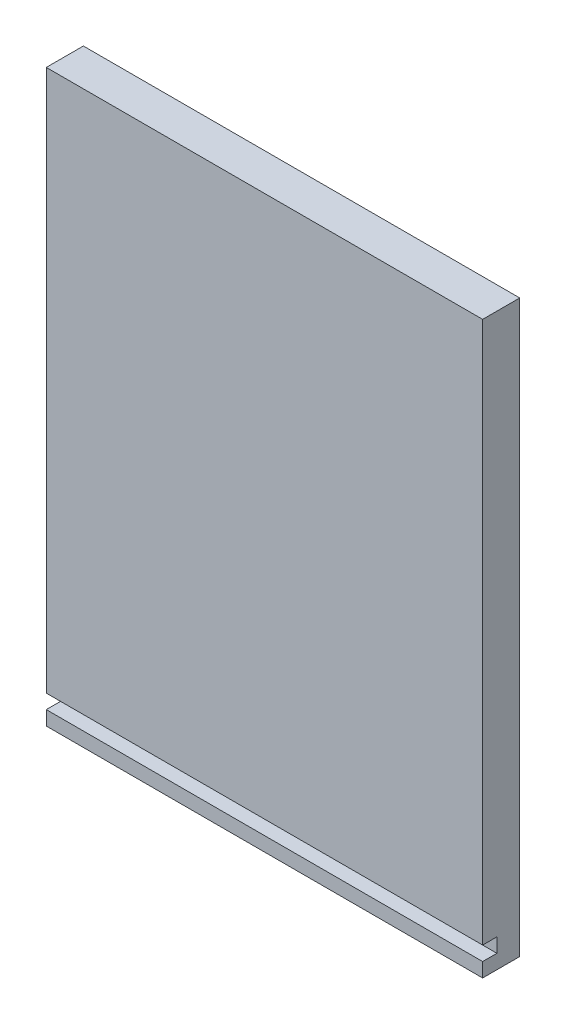
ISO-10303-21;
HEADER;
FILE_DESCRIPTION(('STEP AP214'),'2;1');
FILE_NAME('part.step','',(''),(''),'','','');
FILE_SCHEMA(('AUTOMOTIVE_DESIGN { 1 0 10303 214 1 1 1 1 }'));
ENDSEC;
DATA;
#1=APPLICATION_CONTEXT('core data for automotive mechanical design processes');
#2=APPLICATION_PROTOCOL_DEFINITION('international standard','automotive_design',2000,#1);
#3=PRODUCT_CONTEXT('',#1,'mechanical');
#4=PRODUCT('Part','Part','',(#3));
#5=PRODUCT_RELATED_PRODUCT_CATEGORY('part','',(#4));
#6=PRODUCT_DEFINITION_FORMATION('','',#4);
#7=PRODUCT_DEFINITION_CONTEXT('part definition',#1,'design');
#8=PRODUCT_DEFINITION('design','',#6,#7);
#9=PRODUCT_DEFINITION_SHAPE('','',#8);
#10=(LENGTH_UNIT() NAMED_UNIT(*) SI_UNIT(.MILLI.,.METRE.));
#11=(NAMED_UNIT(*) PLANE_ANGLE_UNIT() SI_UNIT($,.RADIAN.));
#12=(NAMED_UNIT(*) SI_UNIT($,.STERADIAN.) SOLID_ANGLE_UNIT());
#13=UNCERTAINTY_MEASURE_WITH_UNIT(LENGTH_MEASURE(1.E-05),#10,'distance_accuracy_value','');
#14=(GEOMETRIC_REPRESENTATION_CONTEXT(3) GLOBAL_UNCERTAINTY_ASSIGNED_CONTEXT((#13)) GLOBAL_UNIT_ASSIGNED_CONTEXT((#10,
#11,#12)) REPRESENTATION_CONTEXT('',''));
#15=CARTESIAN_POINT('',(0.,0.,0.));
#16=DIRECTION('',(0.,0.,1.));
#17=DIRECTION('',(1.,0.,0.));
#18=AXIS2_PLACEMENT_3D('',#15,#16,#17);
#19=CARTESIAN_POINT('',(0.,0.,13.));
#20=DIRECTION('',(0.,0.,1.));
#21=DIRECTION('',(1.,0.,0.));
#22=AXIS2_PLACEMENT_3D('',#19,#20,#21);
#23=PLANE('',#22);
#24=DIRECTION('',(-1.,0.,0.));
#25=VECTOR('',#24,1.);
#26=CARTESIAN_POINT('',(-53.9801317233809,-56.6642857142857,13.));
#27=LINE('',#26,#25);
#28=CARTESIAN_POINT('',(99.0198682766191,-56.6642857142857,13.));
#29=VERTEX_POINT('',#28);
#30=CARTESIAN_POINT('',(-53.9801317233809,-56.6642857142857,13.));
#31=VERTEX_POINT('',#30);
#32=EDGE_CURVE('E123',#29,#31,#27,.T.);
#33=ORIENTED_EDGE('',*,*,#32,.F.);
#34=DIRECTION('',(0.,1.,0.));
#35=VECTOR('',#34,1.);
#36=CARTESIAN_POINT('',(99.0198682766191,133.335714285714,13.));
#37=LINE('',#36,#35);
#38=CARTESIAN_POINT('',(99.0198682766191,133.335714285714,13.));
#39=VERTEX_POINT('',#38);
#40=EDGE_CURVE('E136',#29,#39,#37,.T.);
#41=ORIENTED_EDGE('',*,*,#40,.T.);
#42=DIRECTION('',(-1.,0.,0.));
#43=VECTOR('',#42,1.);
#44=CARTESIAN_POINT('',(-53.9801317233809,133.335714285714,13.));
#45=LINE('',#44,#43);
#46=CARTESIAN_POINT('',(-53.9801317233809,133.335714285714,13.));
#47=VERTEX_POINT('',#46);
#48=EDGE_CURVE('E57',#39,#47,#45,.T.);
#49=ORIENTED_EDGE('',*,*,#48,.T.);
#50=DIRECTION('',(0.,-1.,0.));
#51=VECTOR('',#50,1.);
#52=CARTESIAN_POINT('',(-53.9801317233809,133.335714285714,13.));
#53=LINE('',#52,#51);
#54=EDGE_CURVE('E132',#47,#31,#53,.T.);
#55=ORIENTED_EDGE('',*,*,#54,.T.);
#56=EDGE_LOOP('',(#33,#41,#49,#55));
#57=FACE_BOUND('',#56,.T.);
#58=ADVANCED_FACE('F33',(#57),#23,.T.);
#59=CARTESIAN_POINT('',(-53.9801317233809,133.335714285714,13.));
#60=DIRECTION('',(1.,0.,0.));
#61=DIRECTION('',(0.,1.,0.));
#62=AXIS2_PLACEMENT_3D('',#59,#60,#61);
#63=PLANE('',#62);
#64=DIRECTION('',(0.,-1.,0.));
#65=VECTOR('',#64,1.);
#66=CARTESIAN_POINT('',(-53.9801317233809,-56.6642857142857,8.));
#67=LINE('',#66,#65);
#68=CARTESIAN_POINT('',(-53.9801317233809,-56.6642857142857,8.));
#69=VERTEX_POINT('',#68);
#70=CARTESIAN_POINT('',(-53.9801317233809,-61.6642857142857,8.));
#71=VERTEX_POINT('',#70);
#72=EDGE_CURVE('E114',#69,#71,#67,.T.);
#73=ORIENTED_EDGE('',*,*,#72,.F.);
#74=DIRECTION('',(0.,0.,1.));
#75=VECTOR('',#74,1.);
#76=CARTESIAN_POINT('',(-53.9801317233809,-56.6642857142857,8.));
#77=LINE('',#76,#75);
#78=EDGE_CURVE('E146',#69,#31,#77,.T.);
#79=ORIENTED_EDGE('',*,*,#78,.T.);
#80=ORIENTED_EDGE('',*,*,#54,.F.);
#81=DIRECTION('',(0.,0.,-1.));
#82=VECTOR('',#81,1.);
#83=CARTESIAN_POINT('',(-53.9801317233809,133.335714285714,13.));
#84=LINE('',#83,#82);
#85=CARTESIAN_POINT('',(-53.9801317233809,133.335714285714,0.));
#86=VERTEX_POINT('',#85);
#87=EDGE_CURVE('E141',#47,#86,#84,.T.);
#88=ORIENTED_EDGE('',*,*,#87,.T.);
#89=DIRECTION('',(0.,-1.,0.));
#90=VECTOR('',#89,1.);
#91=CARTESIAN_POINT('',(-53.9801317233809,133.335714285714,0.));
#92=LINE('',#91,#90);
#93=CARTESIAN_POINT('',(-53.9801317233809,-66.6642857142857,0.));
#94=VERTEX_POINT('',#93);
#95=EDGE_CURVE('E142',#86,#94,#92,.T.);
#96=ORIENTED_EDGE('',*,*,#95,.T.);
#97=DIRECTION('',(0.,0.,-1.));
#98=VECTOR('',#97,1.);
#99=CARTESIAN_POINT('',(-53.9801317233809,-66.6642857142857,13.));
#100=LINE('',#99,#98);
#101=CARTESIAN_POINT('',(-53.9801317233809,-66.6642857142857,13.));
#102=VERTEX_POINT('',#101);
#103=EDGE_CURVE('E11',#102,#94,#100,.T.);
#104=ORIENTED_EDGE('',*,*,#103,.F.);
#105=CARTESIAN_POINT('',(-53.9801317233809,-61.6642857142857,13.));
#106=VERTEX_POINT('',#105);
#107=EDGE_CURVE('E85',#106,#102,#53,.T.);
#108=ORIENTED_EDGE('',*,*,#107,.F.);
#109=DIRECTION('',(0.,0.,1.));
#110=VECTOR('',#109,1.);
#111=CARTESIAN_POINT('',(-53.9801317233809,-61.6642857142857,8.));
#112=LINE('',#111,#110);
#113=EDGE_CURVE('E48',#71,#106,#112,.T.);
#114=ORIENTED_EDGE('',*,*,#113,.F.);
#115=EDGE_LOOP('',(#73,#79,#80,#88,#96,#104,#108,#114));
#116=FACE_BOUND('',#115,.T.);
#117=ADVANCED_FACE('F35',(#116),#63,.F.);
#118=CARTESIAN_POINT('',(-53.9801317233809,-66.6642857142857,13.));
#119=DIRECTION('',(0.,1.,0.));
#120=DIRECTION('',(0.,0.,1.));
#121=AXIS2_PLACEMENT_3D('',#118,#119,#120);
#122=PLANE('',#121);
#123=DIRECTION('',(1.,0.,0.));
#124=VECTOR('',#123,1.);
#125=CARTESIAN_POINT('',(-53.9801317233809,-66.6642857142857,0.));
#126=LINE('',#125,#124);
#127=CARTESIAN_POINT('',(99.0198682766191,-66.6642857142857,0.));
#128=VERTEX_POINT('',#127);
#129=EDGE_CURVE('E145',#94,#128,#126,.T.);
#130=ORIENTED_EDGE('',*,*,#129,.T.);
#131=DIRECTION('',(0.,0.,-1.));
#132=VECTOR('',#131,1.);
#133=CARTESIAN_POINT('',(99.0198682766191,-66.6642857142857,13.));
#134=LINE('',#133,#132);
#135=CARTESIAN_POINT('',(99.0198682766191,-66.6642857142857,13.));
#136=VERTEX_POINT('',#135);
#137=EDGE_CURVE('E41',#136,#128,#134,.T.);
#138=ORIENTED_EDGE('',*,*,#137,.F.);
#139=DIRECTION('',(1.,0.,0.));
#140=VECTOR('',#139,1.);
#141=CARTESIAN_POINT('',(-53.9801317233809,-66.6642857142857,13.));
#142=LINE('',#141,#140);
#143=EDGE_CURVE('E134',#102,#136,#142,.T.);
#144=ORIENTED_EDGE('',*,*,#143,.F.);
#145=ORIENTED_EDGE('',*,*,#103,.T.);
#146=EDGE_LOOP('',(#130,#138,#144,#145));
#147=FACE_BOUND('',#146,.T.);
#148=ADVANCED_FACE('F190',(#147),#122,.F.);
#149=CARTESIAN_POINT('',(99.0198682766191,133.335714285714,13.));
#150=DIRECTION('',(-1.,0.,0.));
#151=DIRECTION('',(0.,-1.,0.));
#152=AXIS2_PLACEMENT_3D('',#149,#150,#151);
#153=PLANE('',#152);
#154=ORIENTED_EDGE('',*,*,#40,.F.);
#155=DIRECTION('',(0.,0.,1.));
#156=VECTOR('',#155,1.);
#157=CARTESIAN_POINT('',(99.0198682766191,-56.6642857142857,8.));
#158=LINE('',#157,#156);
#159=CARTESIAN_POINT('',(99.0198682766191,-56.6642857142857,8.));
#160=VERTEX_POINT('',#159);
#161=EDGE_CURVE('E127',#160,#29,#158,.T.);
#162=ORIENTED_EDGE('',*,*,#161,.F.);
#163=DIRECTION('',(0.,1.,0.));
#164=VECTOR('',#163,1.);
#165=CARTESIAN_POINT('',(99.0198682766191,-56.6642857142857,8.));
#166=LINE('',#165,#164);
#167=CARTESIAN_POINT('',(99.0198682766191,-61.6642857142857,8.));
#168=VERTEX_POINT('',#167);
#169=EDGE_CURVE('E113',#168,#160,#166,.T.);
#170=ORIENTED_EDGE('',*,*,#169,.F.);
#171=DIRECTION('',(0.,0.,1.));
#172=VECTOR('',#171,1.);
#173=CARTESIAN_POINT('',(99.0198682766191,-61.6642857142857,8.));
#174=LINE('',#173,#172);
#175=CARTESIAN_POINT('',(99.0198682766191,-61.6642857142857,13.));
#176=VERTEX_POINT('',#175);
#177=EDGE_CURVE('E110',#168,#176,#174,.T.);
#178=ORIENTED_EDGE('',*,*,#177,.T.);
#179=EDGE_CURVE('E137',#136,#176,#37,.T.);
#180=ORIENTED_EDGE('',*,*,#179,.F.);
#181=ORIENTED_EDGE('',*,*,#137,.T.);
#182=DIRECTION('',(0.,1.,0.));
#183=VECTOR('',#182,1.);
#184=CARTESIAN_POINT('',(99.0198682766191,133.335714285714,0.));
#185=LINE('',#184,#183);
#186=CARTESIAN_POINT('',(99.0198682766191,133.335714285714,0.));
#187=VERTEX_POINT('',#186);
#188=EDGE_CURVE('E148',#128,#187,#185,.T.);
#189=ORIENTED_EDGE('',*,*,#188,.T.);
#190=DIRECTION('',(0.,0.,-1.));
#191=VECTOR('',#190,1.);
#192=CARTESIAN_POINT('',(99.0198682766191,133.335714285714,13.));
#193=LINE('',#192,#191);
#194=EDGE_CURVE('E152',#39,#187,#193,.T.);
#195=ORIENTED_EDGE('',*,*,#194,.F.);
#196=EDGE_LOOP('',(#154,#162,#170,#178,#180,#181,#189,#195));
#197=FACE_BOUND('',#196,.T.);
#198=ADVANCED_FACE('F159',(#197),#153,.F.);
#199=CARTESIAN_POINT('',(-53.9801317233809,133.335714285714,13.));
#200=DIRECTION('',(0.,-1.,0.));
#201=DIRECTION('',(0.,0.,-1.));
#202=AXIS2_PLACEMENT_3D('',#199,#200,#201);
#203=PLANE('',#202);
#204=DIRECTION('',(-1.,0.,0.));
#205=VECTOR('',#204,1.);
#206=CARTESIAN_POINT('',(-53.9801317233809,133.335714285714,0.));
#207=LINE('',#206,#205);
#208=EDGE_CURVE('E78',#187,#86,#207,.T.);
#209=ORIENTED_EDGE('',*,*,#208,.T.);
#210=ORIENTED_EDGE('',*,*,#87,.F.);
#211=ORIENTED_EDGE('',*,*,#48,.F.);
#212=ORIENTED_EDGE('',*,*,#194,.T.);
#213=EDGE_LOOP('',(#209,#210,#211,#212));
#214=FACE_BOUND('',#213,.T.);
#215=ADVANCED_FACE('F166',(#214),#203,.F.);
#216=DIRECTION('',(1.,0.,0.));
#217=VECTOR('',#216,1.);
#218=CARTESIAN_POINT('',(-53.9801317233809,-61.6642857142857,13.));
#219=LINE('',#218,#217);
#220=EDGE_CURVE('E170',#106,#176,#219,.T.);
#221=ORIENTED_EDGE('',*,*,#220,.F.);
#222=ORIENTED_EDGE('',*,*,#107,.T.);
#223=ORIENTED_EDGE('',*,*,#143,.T.);
#224=ORIENTED_EDGE('',*,*,#179,.T.);
#225=EDGE_LOOP('',(#221,#222,#223,#224));
#226=FACE_BOUND('',#225,.T.);
#227=ADVANCED_FACE('F182',(#226),#23,.T.);
#228=CARTESIAN_POINT('',(0.,0.,0.));
#229=DIRECTION('',(0.,0.,1.));
#230=DIRECTION('',(1.,0.,0.));
#231=AXIS2_PLACEMENT_3D('',#228,#229,#230);
#232=PLANE('',#231);
#233=ORIENTED_EDGE('',*,*,#95,.F.);
#234=ORIENTED_EDGE('',*,*,#208,.F.);
#235=ORIENTED_EDGE('',*,*,#188,.F.);
#236=ORIENTED_EDGE('',*,*,#129,.F.);
#237=EDGE_LOOP('',(#233,#234,#235,#236));
#238=FACE_BOUND('',#237,.T.);
#239=ADVANCED_FACE('F164',(#238),#232,.F.);
#240=CARTESIAN_POINT('',(-53.9801317233809,-56.6642857142857,8.));
#241=DIRECTION('',(0.,1.,0.));
#242=DIRECTION('',(0.,0.,1.));
#243=AXIS2_PLACEMENT_3D('',#240,#241,#242);
#244=PLANE('',#243);
#245=ORIENTED_EDGE('',*,*,#32,.T.);
#246=ORIENTED_EDGE('',*,*,#78,.F.);
#247=DIRECTION('',(-1.,0.,0.));
#248=VECTOR('',#247,1.);
#249=CARTESIAN_POINT('',(-53.9801317233809,-56.6642857142857,8.));
#250=LINE('',#249,#248);
#251=EDGE_CURVE('E120',#160,#69,#250,.T.);
#252=ORIENTED_EDGE('',*,*,#251,.F.);
#253=ORIENTED_EDGE('',*,*,#161,.T.);
#254=EDGE_LOOP('',(#245,#246,#252,#253));
#255=FACE_BOUND('',#254,.T.);
#256=ADVANCED_FACE('F174',(#255),#244,.F.);
#257=CARTESIAN_POINT('',(-53.9801317233809,-61.6642857142857,8.));
#258=DIRECTION('',(0.,-1.,0.));
#259=DIRECTION('',(0.,0.,-1.));
#260=AXIS2_PLACEMENT_3D('',#257,#258,#259);
#261=PLANE('',#260);
#262=ORIENTED_EDGE('',*,*,#220,.T.);
#263=ORIENTED_EDGE('',*,*,#177,.F.);
#264=DIRECTION('',(1.,0.,0.));
#265=VECTOR('',#264,1.);
#266=CARTESIAN_POINT('',(-53.9801317233809,-61.6642857142857,8.));
#267=LINE('',#266,#265);
#268=EDGE_CURVE('E106',#71,#168,#267,.T.);
#269=ORIENTED_EDGE('',*,*,#268,.F.);
#270=ORIENTED_EDGE('',*,*,#113,.T.);
#271=EDGE_LOOP('',(#262,#263,#269,#270));
#272=FACE_BOUND('',#271,.T.);
#273=ADVANCED_FACE('F108',(#272),#261,.F.);
#274=CARTESIAN_POINT('',(0.,0.,8.));
#275=DIRECTION('',(0.,0.,1.));
#276=DIRECTION('',(1.,0.,0.));
#277=AXIS2_PLACEMENT_3D('',#274,#275,#276);
#278=PLANE('',#277);
#279=ORIENTED_EDGE('',*,*,#72,.T.);
#280=ORIENTED_EDGE('',*,*,#268,.T.);
#281=ORIENTED_EDGE('',*,*,#169,.T.);
#282=ORIENTED_EDGE('',*,*,#251,.T.);
#283=EDGE_LOOP('',(#279,#280,#281,#282));
#284=FACE_BOUND('',#283,.T.);
#285=ADVANCED_FACE('F118',(#284),#278,.T.);
#286=CLOSED_SHELL('',(#58,#117,#148,#198,#215,#227,#239,#256,#273,#285));
#287=MANIFOLD_SOLID_BREP('B2',#286);
#288=ADVANCED_BREP_SHAPE_REPRESENTATION('',(#18,#287),#14);
#289=SHAPE_DEFINITION_REPRESENTATION(#9,#288);
ENDSEC;
END-ISO-10303-21;
